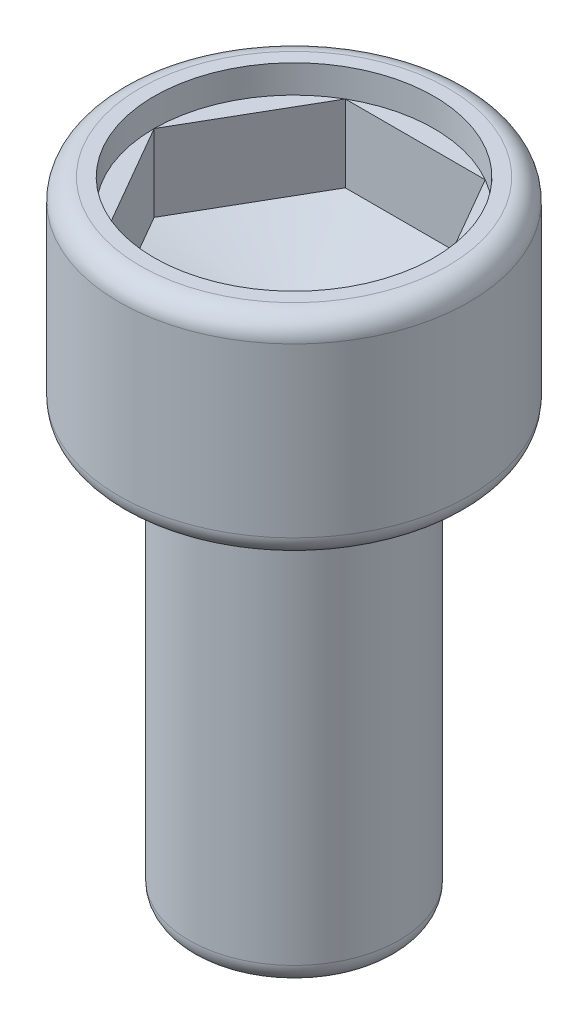
ISO-10303-21;
HEADER;
FILE_DESCRIPTION(('STEP AP214'),'2;1');
FILE_NAME('part.step','',(''),(''),'','','');
FILE_SCHEMA(('AUTOMOTIVE_DESIGN { 1 0 10303 214 1 1 1 1 }'));
ENDSEC;
DATA;
#1=APPLICATION_CONTEXT('core data for automotive mechanical design processes');
#2=APPLICATION_PROTOCOL_DEFINITION('international standard','automotive_design',2000,#1);
#3=PRODUCT_CONTEXT('',#1,'mechanical');
#4=PRODUCT('Part','Part','',(#3));
#5=PRODUCT_RELATED_PRODUCT_CATEGORY('part','',(#4));
#6=PRODUCT_DEFINITION_FORMATION('','',#4);
#7=PRODUCT_DEFINITION_CONTEXT('part definition',#1,'design');
#8=PRODUCT_DEFINITION('design','',#6,#7);
#9=PRODUCT_DEFINITION_SHAPE('','',#8);
#10=(LENGTH_UNIT() NAMED_UNIT(*) SI_UNIT(.MILLI.,.METRE.));
#11=(NAMED_UNIT(*) PLANE_ANGLE_UNIT() SI_UNIT($,.RADIAN.));
#12=(NAMED_UNIT(*) SI_UNIT($,.STERADIAN.) SOLID_ANGLE_UNIT());
#13=UNCERTAINTY_MEASURE_WITH_UNIT(LENGTH_MEASURE(1.E-05),#10,'distance_accuracy_value','');
#14=(GEOMETRIC_REPRESENTATION_CONTEXT(3) GLOBAL_UNCERTAINTY_ASSIGNED_CONTEXT((#13)) GLOBAL_UNIT_ASSIGNED_CONTEXT((#10,
#11,#12)) REPRESENTATION_CONTEXT('',''));
#15=CARTESIAN_POINT('',(0.,0.,0.));
#16=DIRECTION('',(0.,0.,1.));
#17=DIRECTION('',(1.,0.,0.));
#18=AXIS2_PLACEMENT_3D('',#15,#16,#17);
#19=CARTESIAN_POINT('',(0.,3.,0.));
#20=DIRECTION('',(0.,-1.,0.));
#21=DIRECTION('',(0.,0.,-1.));
#22=AXIS2_PLACEMENT_3D('',#19,#20,#21);
#23=CYLINDRICAL_SURFACE('',#22,2.5);
#24=CARTESIAN_POINT('',(0.,0.3,0.));
#25=DIRECTION('',(0.,1.,0.));
#26=DIRECTION('',(0.,0.,1.));
#27=AXIS2_PLACEMENT_3D('',#24,#25,#26);
#28=CIRCLE('',#27,2.5);
#29=CARTESIAN_POINT('',(0.,0.3,2.5));
#30=VERTEX_POINT('',#29);
#31=EDGE_CURVE('E188',#30,#30,#28,.T.);
#32=ORIENTED_EDGE('',*,*,#31,.T.);
#33=EDGE_LOOP('',(#32));
#34=FACE_BOUND('',#33,.T.);
#35=CARTESIAN_POINT('',(0.,2.7,0.));
#36=DIRECTION('',(0.,1.,0.));
#37=DIRECTION('',(0.,0.,1.));
#38=AXIS2_PLACEMENT_3D('',#35,#36,#37);
#39=CIRCLE('',#38,2.5);
#40=CARTESIAN_POINT('',(0.,2.7,2.5));
#41=VERTEX_POINT('',#40);
#42=EDGE_CURVE('E184',#41,#41,#39,.F.);
#43=ORIENTED_EDGE('',*,*,#42,.T.);
#44=EDGE_LOOP('',(#43));
#45=FACE_BOUND('',#44,.T.);
#46=ADVANCED_FACE('F50',(#34,#45),#23,.T.);
#47=CARTESIAN_POINT('',(0.,3.,0.));
#48=DIRECTION('',(0.,1.,0.));
#49=DIRECTION('',(0.,0.,1.));
#50=AXIS2_PLACEMENT_3D('',#47,#48,#49);
#51=PLANE('',#50);
#52=CARTESIAN_POINT('',(0.,3.,0.));
#53=DIRECTION('',(0.,1.,0.));
#54=DIRECTION('',(0.,0.,1.));
#55=AXIS2_PLACEMENT_3D('',#52,#53,#54);
#56=CIRCLE('',#55,2.2);
#57=CARTESIAN_POINT('',(0.,3.,2.2));
#58=VERTEX_POINT('',#57);
#59=EDGE_CURVE('E196',#58,#58,#56,.T.);
#60=ORIENTED_EDGE('',*,*,#59,.T.);
#61=EDGE_LOOP('',(#60));
#62=FACE_BOUND('',#61,.T.);
#63=CARTESIAN_POINT('',(0.,3.,0.));
#64=DIRECTION('',(0.,1.,0.));
#65=DIRECTION('',(0.,0.,1.));
#66=AXIS2_PLACEMENT_3D('',#63,#64,#65);
#67=CIRCLE('',#66,2.);
#68=CARTESIAN_POINT('',(0.,3.,2.));
#69=VERTEX_POINT('',#68);
#70=EDGE_CURVE('E122',#69,#69,#67,.T.);
#71=ORIENTED_EDGE('',*,*,#70,.F.);
#72=EDGE_LOOP('',(#71));
#73=FACE_BOUND('',#72,.T.);
#74=ADVANCED_FACE('F215',(#62,#73),#51,.T.);
#75=CARTESIAN_POINT('',(0.,0.,0.));
#76=DIRECTION('',(0.,1.,0.));
#77=DIRECTION('',(0.,0.,1.));
#78=AXIS2_PLACEMENT_3D('',#75,#76,#77);
#79=PLANE('',#78);
#80=CARTESIAN_POINT('',(0.,0.,0.));
#81=DIRECTION('',(0.,1.,0.));
#82=DIRECTION('',(0.,0.,1.));
#83=AXIS2_PLACEMENT_3D('',#80,#81,#82);
#84=CIRCLE('',#83,2.2);
#85=CARTESIAN_POINT('',(0.,0.,2.2));
#86=VERTEX_POINT('',#85);
#87=EDGE_CURVE('E192',#86,#86,#84,.F.);
#88=ORIENTED_EDGE('',*,*,#87,.T.);
#89=EDGE_LOOP('',(#88));
#90=FACE_BOUND('',#89,.T.);
#91=CARTESIAN_POINT('',(0.,0.,0.));
#92=DIRECTION('',(0.,-1.,0.));
#93=DIRECTION('',(0.,0.,-1.));
#94=AXIS2_PLACEMENT_3D('',#91,#92,#93);
#95=CIRCLE('',#94,1.5);
#96=CARTESIAN_POINT('',(0.,0.,-1.5));
#97=VERTEX_POINT('',#96);
#98=EDGE_CURVE('E183',#97,#97,#95,.T.);
#99=ORIENTED_EDGE('',*,*,#98,.F.);
#100=EDGE_LOOP('',(#99));
#101=FACE_BOUND('',#100,.T.);
#102=ADVANCED_FACE('F221',(#90,#101),#79,.F.);
#103=CARTESIAN_POINT('',(0.,2.6,0.));
#104=DIRECTION('',(0.,1.,0.));
#105=DIRECTION('',(0.,0.,1.));
#106=AXIS2_PLACEMENT_3D('',#103,#104,#105);
#107=CYLINDRICAL_SURFACE('',#106,2.);
#108=ORIENTED_EDGE('',*,*,#70,.T.);
#109=EDGE_LOOP('',(#108));
#110=FACE_BOUND('',#109,.T.);
#111=CARTESIAN_POINT('',(0.,2.6,0.));
#112=DIRECTION('',(0.,1.,0.));
#113=DIRECTION('',(0.,0.,1.));
#114=AXIS2_PLACEMENT_3D('',#111,#112,#113);
#115=CIRCLE('',#114,2.);
#116=CARTESIAN_POINT('',(-1.,2.6,1.73205080756888));
#117=VERTEX_POINT('',#116);
#118=CARTESIAN_POINT('',(0.999999999999999,2.6,1.73205080756888));
#119=VERTEX_POINT('',#118);
#120=EDGE_CURVE('E251',#117,#119,#115,.T.);
#121=ORIENTED_EDGE('',*,*,#120,.F.);
#122=CARTESIAN_POINT('',(-2.,2.6,0.));
#123=VERTEX_POINT('',#122);
#124=EDGE_CURVE('E279',#123,#117,#115,.T.);
#125=ORIENTED_EDGE('',*,*,#124,.F.);
#126=CARTESIAN_POINT('',(-0.999999999999998,2.6,-1.73205080756888));
#127=VERTEX_POINT('',#126);
#128=EDGE_CURVE('E294',#127,#123,#115,.T.);
#129=ORIENTED_EDGE('',*,*,#128,.F.);
#130=CARTESIAN_POINT('',(1.,2.6,-1.73205080756888));
#131=VERTEX_POINT('',#130);
#132=EDGE_CURVE('E301',#131,#127,#115,.T.);
#133=ORIENTED_EDGE('',*,*,#132,.F.);
#134=CARTESIAN_POINT('',(2.,2.6,0.));
#135=VERTEX_POINT('',#134);
#136=EDGE_CURVE('E65',#135,#131,#115,.T.);
#137=ORIENTED_EDGE('',*,*,#136,.F.);
#138=EDGE_CURVE('E246',#119,#135,#115,.T.);
#139=ORIENTED_EDGE('',*,*,#138,.F.);
#140=EDGE_LOOP('',(#121,#125,#129,#133,#137,#139));
#141=FACE_BOUND('',#140,.T.);
#142=ADVANCED_FACE('F239',(#110,#141),#107,.F.);
#143=CARTESIAN_POINT('',(0.,2.6,0.));
#144=DIRECTION('',(0.,1.,0.));
#145=DIRECTION('',(0.,0.,1.));
#146=AXIS2_PLACEMENT_3D('',#143,#144,#145);
#147=PLANE('',#146);
#148=DIRECTION('',(-0.5,0.,0.866025403784439));
#149=VECTOR('',#148,1.);
#150=CARTESIAN_POINT('',(1.,2.6,1.73205080756888));
#151=LINE('',#150,#149);
#152=EDGE_CURVE('E133',#135,#119,#151,.T.);
#153=ORIENTED_EDGE('',*,*,#152,.T.);
#154=ORIENTED_EDGE('',*,*,#138,.T.);
#155=EDGE_LOOP('',(#153,#154));
#156=FACE_BOUND('',#155,.T.);
#157=ADVANCED_FACE('F269',(#156),#147,.T.);
#158=DIRECTION('',(-1.,0.,0.));
#159=VECTOR('',#158,1.);
#160=CARTESIAN_POINT('',(-1.,2.6,1.73205080756888));
#161=LINE('',#160,#159);
#162=EDGE_CURVE('E264',#119,#117,#161,.T.);
#163=ORIENTED_EDGE('',*,*,#162,.T.);
#164=ORIENTED_EDGE('',*,*,#120,.T.);
#165=EDGE_LOOP('',(#163,#164));
#166=FACE_BOUND('',#165,.T.);
#167=ADVANCED_FACE('F273',(#166),#147,.T.);
#168=DIRECTION('',(-0.5,0.,-0.866025403784439));
#169=VECTOR('',#168,1.);
#170=CARTESIAN_POINT('',(-2.,2.6,0.));
#171=LINE('',#170,#169);
#172=EDGE_CURVE('E261',#117,#123,#171,.T.);
#173=ORIENTED_EDGE('',*,*,#172,.T.);
#174=ORIENTED_EDGE('',*,*,#124,.T.);
#175=EDGE_LOOP('',(#173,#174));
#176=FACE_BOUND('',#175,.T.);
#177=ADVANCED_FACE('F291',(#176),#147,.T.);
#178=DIRECTION('',(0.5,0.,-0.866025403784439));
#179=VECTOR('',#178,1.);
#180=CARTESIAN_POINT('',(-1.,2.6,-1.73205080756888));
#181=LINE('',#180,#179);
#182=EDGE_CURVE('E258',#123,#127,#181,.T.);
#183=ORIENTED_EDGE('',*,*,#182,.T.);
#184=ORIENTED_EDGE('',*,*,#128,.T.);
#185=EDGE_LOOP('',(#183,#184));
#186=FACE_BOUND('',#185,.T.);
#187=ADVANCED_FACE('F299',(#186),#147,.T.);
#188=DIRECTION('',(1.,0.,0.));
#189=VECTOR('',#188,1.);
#190=CARTESIAN_POINT('',(1.,2.6,-1.73205080756888));
#191=LINE('',#190,#189);
#192=EDGE_CURVE('E250',#127,#131,#191,.T.);
#193=ORIENTED_EDGE('',*,*,#192,.T.);
#194=ORIENTED_EDGE('',*,*,#132,.T.);
#195=EDGE_LOOP('',(#193,#194));
#196=FACE_BOUND('',#195,.T.);
#197=ADVANCED_FACE('F310',(#196),#147,.T.);
#198=DIRECTION('',(0.5,0.,0.866025403784439));
#199=VECTOR('',#198,1.);
#200=CARTESIAN_POINT('',(2.,2.6,0.));
#201=LINE('',#200,#199);
#202=EDGE_CURVE('E166',#131,#135,#201,.T.);
#203=ORIENTED_EDGE('',*,*,#202,.T.);
#204=ORIENTED_EDGE('',*,*,#136,.T.);
#205=EDGE_LOOP('',(#203,#204));
#206=FACE_BOUND('',#205,.T.);
#207=ADVANCED_FACE('F311',(#206),#147,.T.);
#208=CARTESIAN_POINT('',(2.,1.5,0.));
#209=DIRECTION('',(0.866025403784439,0.,-0.5));
#210=DIRECTION('',(-0.5,0.,-0.866025403784439));
#211=AXIS2_PLACEMENT_3D('',#208,#209,#210);
#212=PLANE('',#211);
#213=ORIENTED_EDGE('',*,*,#202,.F.);
#214=DIRECTION('',(0.,1.,0.));
#215=VECTOR('',#214,1.);
#216=CARTESIAN_POINT('',(1.,1.5,-1.73205080756888));
#217=LINE('',#216,#215);
#218=CARTESIAN_POINT('',(0.999999999999999,1.5,-1.73205080756888));
#219=VERTEX_POINT('',#218);
#220=EDGE_CURVE('E137',#219,#131,#217,.T.);
#221=ORIENTED_EDGE('',*,*,#220,.F.);
#222=DIRECTION('',(-0.5,0.,-0.866025403784439));
#223=VECTOR('',#222,1.);
#224=CARTESIAN_POINT('',(2.,1.5,0.));
#225=LINE('',#224,#223);
#226=CARTESIAN_POINT('',(2.,1.5,0.));
#227=VERTEX_POINT('',#226);
#228=EDGE_CURVE('E140',#227,#219,#225,.T.);
#229=ORIENTED_EDGE('',*,*,#228,.F.);
#230=DIRECTION('',(0.,1.,0.));
#231=VECTOR('',#230,1.);
#232=CARTESIAN_POINT('',(2.,1.5,0.));
#233=LINE('',#232,#231);
#234=EDGE_CURVE('E128',#227,#135,#233,.T.);
#235=ORIENTED_EDGE('',*,*,#234,.T.);
#236=EDGE_LOOP('',(#213,#221,#229,#235));
#237=FACE_BOUND('',#236,.T.);
#238=ADVANCED_FACE('F141',(#237),#212,.F.);
#239=CARTESIAN_POINT('',(1.,1.5,-1.73205080756888));
#240=DIRECTION('',(0.,0.,-1.));
#241=DIRECTION('',(-1.,0.,0.));
#242=AXIS2_PLACEMENT_3D('',#239,#240,#241);
#243=PLANE('',#242);
#244=ORIENTED_EDGE('',*,*,#192,.F.);
#245=DIRECTION('',(0.,1.,0.));
#246=VECTOR('',#245,1.);
#247=CARTESIAN_POINT('',(-1.,1.5,-1.73205080756888));
#248=LINE('',#247,#246);
#249=CARTESIAN_POINT('',(-1.,1.5,-1.73205080756888));
#250=VERTEX_POINT('',#249);
#251=EDGE_CURVE('E175',#250,#127,#248,.T.);
#252=ORIENTED_EDGE('',*,*,#251,.F.);
#253=DIRECTION('',(-1.,0.,0.));
#254=VECTOR('',#253,1.);
#255=CARTESIAN_POINT('',(1.,1.5,-1.73205080756888));
#256=LINE('',#255,#254);
#257=EDGE_CURVE('E147',#219,#250,#256,.T.);
#258=ORIENTED_EDGE('',*,*,#257,.F.);
#259=ORIENTED_EDGE('',*,*,#220,.T.);
#260=EDGE_LOOP('',(#244,#252,#258,#259));
#261=FACE_BOUND('',#260,.T.);
#262=ADVANCED_FACE('F308',(#261),#243,.F.);
#263=CARTESIAN_POINT('',(-1.,1.5,-1.73205080756888));
#264=DIRECTION('',(-0.866025403784439,0.,-0.5));
#265=DIRECTION('',(-0.5,0.,0.866025403784439));
#266=AXIS2_PLACEMENT_3D('',#263,#264,#265);
#267=PLANE('',#266);
#268=ORIENTED_EDGE('',*,*,#182,.F.);
#269=DIRECTION('',(0.,1.,0.));
#270=VECTOR('',#269,1.);
#271=CARTESIAN_POINT('',(-2.,1.5,0.));
#272=LINE('',#271,#270);
#273=CARTESIAN_POINT('',(-2.,1.5,0.));
#274=VERTEX_POINT('',#273);
#275=EDGE_CURVE('E171',#274,#123,#272,.T.);
#276=ORIENTED_EDGE('',*,*,#275,.F.);
#277=DIRECTION('',(-0.5,0.,0.866025403784439));
#278=VECTOR('',#277,1.);
#279=CARTESIAN_POINT('',(-1.,1.5,-1.73205080756888));
#280=LINE('',#279,#278);
#281=EDGE_CURVE('E151',#250,#274,#280,.T.);
#282=ORIENTED_EDGE('',*,*,#281,.F.);
#283=ORIENTED_EDGE('',*,*,#251,.T.);
#284=EDGE_LOOP('',(#268,#276,#282,#283));
#285=FACE_BOUND('',#284,.T.);
#286=ADVANCED_FACE('F303',(#285),#267,.F.);
#287=CARTESIAN_POINT('',(-2.,1.5,0.));
#288=DIRECTION('',(-0.866025403784439,0.,0.5));
#289=DIRECTION('',(0.5,0.,0.866025403784439));
#290=AXIS2_PLACEMENT_3D('',#287,#288,#289);
#291=PLANE('',#290);
#292=ORIENTED_EDGE('',*,*,#172,.F.);
#293=DIRECTION('',(0.,1.,0.));
#294=VECTOR('',#293,1.);
#295=CARTESIAN_POINT('',(-1.,1.5,1.73205080756888));
#296=LINE('',#295,#294);
#297=CARTESIAN_POINT('',(-1.,1.5,1.73205080756888));
#298=VERTEX_POINT('',#297);
#299=EDGE_CURVE('E167',#298,#117,#296,.T.);
#300=ORIENTED_EDGE('',*,*,#299,.F.);
#301=DIRECTION('',(0.5,0.,0.866025403784439));
#302=VECTOR('',#301,1.);
#303=CARTESIAN_POINT('',(-2.,1.5,0.));
#304=LINE('',#303,#302);
#305=EDGE_CURVE('E158',#274,#298,#304,.T.);
#306=ORIENTED_EDGE('',*,*,#305,.F.);
#307=ORIENTED_EDGE('',*,*,#275,.T.);
#308=EDGE_LOOP('',(#292,#300,#306,#307));
#309=FACE_BOUND('',#308,.T.);
#310=ADVANCED_FACE('F288',(#309),#291,.F.);
#311=CARTESIAN_POINT('',(-1.,1.5,1.73205080756888));
#312=DIRECTION('',(0.,0.,1.));
#313=DIRECTION('',(1.,0.,0.));
#314=AXIS2_PLACEMENT_3D('',#311,#312,#313);
#315=PLANE('',#314);
#316=ORIENTED_EDGE('',*,*,#162,.F.);
#317=DIRECTION('',(0.,1.,0.));
#318=VECTOR('',#317,1.);
#319=CARTESIAN_POINT('',(1.,1.5,1.73205080756888));
#320=LINE('',#319,#318);
#321=CARTESIAN_POINT('',(1.,1.5,1.73205080756888));
#322=VERTEX_POINT('',#321);
#323=EDGE_CURVE('E163',#322,#119,#320,.T.);
#324=ORIENTED_EDGE('',*,*,#323,.F.);
#325=DIRECTION('',(1.,0.,0.));
#326=VECTOR('',#325,1.);
#327=CARTESIAN_POINT('',(-1.,1.5,1.73205080756888));
#328=LINE('',#327,#326);
#329=EDGE_CURVE('E138',#298,#322,#328,.T.);
#330=ORIENTED_EDGE('',*,*,#329,.F.);
#331=ORIENTED_EDGE('',*,*,#299,.T.);
#332=EDGE_LOOP('',(#316,#324,#330,#331));
#333=FACE_BOUND('',#332,.T.);
#334=ADVANCED_FACE('F282',(#333),#315,.F.);
#335=CARTESIAN_POINT('',(1.,1.5,1.73205080756888));
#336=DIRECTION('',(0.866025403784439,0.,0.5));
#337=DIRECTION('',(0.5,0.,-0.866025403784439));
#338=AXIS2_PLACEMENT_3D('',#335,#336,#337);
#339=PLANE('',#338);
#340=ORIENTED_EDGE('',*,*,#152,.F.);
#341=ORIENTED_EDGE('',*,*,#234,.F.);
#342=DIRECTION('',(0.5,0.,-0.866025403784439));
#343=VECTOR('',#342,1.);
#344=CARTESIAN_POINT('',(1.,1.5,1.73205080756888));
#345=LINE('',#344,#343);
#346=EDGE_CURVE('E132',#322,#227,#345,.T.);
#347=ORIENTED_EDGE('',*,*,#346,.F.);
#348=ORIENTED_EDGE('',*,*,#323,.T.);
#349=EDGE_LOOP('',(#340,#341,#347,#348));
#350=FACE_BOUND('',#349,.T.);
#351=ADVANCED_FACE('F130',(#350),#339,.F.);
#352=CARTESIAN_POINT('',(0.,1.5,0.));
#353=DIRECTION('',(0.,1.,0.));
#354=DIRECTION('',(0.,0.,1.));
#355=AXIS2_PLACEMENT_3D('',#352,#353,#354);
#356=PLANE('',#355);
#357=CARTESIAN_POINT('',(0.,1.5,0.));
#358=DIRECTION('',(0.,1.,0.));
#359=DIRECTION('',(0.,0.,1.));
#360=AXIS2_PLACEMENT_3D('',#357,#358,#359);
#361=CIRCLE('',#360,2.);
#362=EDGE_CURVE('E115',#227,#219,#361,.T.);
#363=ORIENTED_EDGE('',*,*,#362,.F.);
#364=ORIENTED_EDGE('',*,*,#228,.T.);
#365=EDGE_LOOP('',(#363,#364));
#366=FACE_BOUND('',#365,.T.);
#367=ADVANCED_FACE('F338',(#366),#356,.F.);
#368=EDGE_CURVE('E369',#219,#250,#361,.T.);
#369=ORIENTED_EDGE('',*,*,#368,.F.);
#370=ORIENTED_EDGE('',*,*,#257,.T.);
#371=EDGE_LOOP('',(#369,#370));
#372=FACE_BOUND('',#371,.T.);
#373=ADVANCED_FACE('F342',(#372),#356,.F.);
#374=EDGE_CURVE('E366',#250,#274,#361,.T.);
#375=ORIENTED_EDGE('',*,*,#374,.F.);
#376=ORIENTED_EDGE('',*,*,#281,.T.);
#377=EDGE_LOOP('',(#375,#376));
#378=FACE_BOUND('',#377,.T.);
#379=ADVANCED_FACE('F347',(#378),#356,.F.);
#380=EDGE_CURVE('E362',#274,#298,#361,.T.);
#381=ORIENTED_EDGE('',*,*,#380,.F.);
#382=ORIENTED_EDGE('',*,*,#305,.T.);
#383=EDGE_LOOP('',(#381,#382));
#384=FACE_BOUND('',#383,.T.);
#385=ADVANCED_FACE('F355',(#384),#356,.F.);
#386=EDGE_CURVE('E119',#298,#322,#361,.T.);
#387=ORIENTED_EDGE('',*,*,#386,.F.);
#388=ORIENTED_EDGE('',*,*,#329,.T.);
#389=EDGE_LOOP('',(#387,#388));
#390=FACE_BOUND('',#389,.T.);
#391=ADVANCED_FACE('F351',(#390),#356,.F.);
#392=EDGE_CURVE('E72',#322,#227,#361,.T.);
#393=ORIENTED_EDGE('',*,*,#392,.F.);
#394=ORIENTED_EDGE('',*,*,#346,.T.);
#395=EDGE_LOOP('',(#393,#394));
#396=FACE_BOUND('',#395,.T.);
#397=ADVANCED_FACE('F109',(#396),#356,.F.);
#398=CARTESIAN_POINT('',(0.,1.5,0.));
#399=DIRECTION('',(0.,1.,0.));
#400=DIRECTION('',(0.,0.,1.));
#401=AXIS2_PLACEMENT_3D('',#398,#399,#400);
#402=CONICAL_SURFACE('',#401,2.,1.32645023151569);
#403=CARTESIAN_POINT('',(0.,1.00134399431364,0.));
#404=VERTEX_POINT('',#403);
#405=VERTEX_LOOP('',#404);
#406=FACE_BOUND('',#405,.T.);
#407=ORIENTED_EDGE('',*,*,#392,.T.);
#408=ORIENTED_EDGE('',*,*,#362,.T.);
#409=ORIENTED_EDGE('',*,*,#368,.T.);
#410=ORIENTED_EDGE('',*,*,#374,.T.);
#411=ORIENTED_EDGE('',*,*,#380,.T.);
#412=ORIENTED_EDGE('',*,*,#386,.T.);
#413=EDGE_LOOP('',(#407,#408,#409,#410,#411,#412));
#414=FACE_BOUND('',#413,.T.);
#415=ADVANCED_FACE('F105',(#406,#414),#402,.F.);
#416=CARTESIAN_POINT('',(0.,-6.,0.));
#417=DIRECTION('',(0.,1.,0.));
#418=DIRECTION('',(0.,0.,1.));
#419=AXIS2_PLACEMENT_3D('',#416,#417,#418);
#420=CYLINDRICAL_SURFACE('',#419,1.5);
#421=CARTESIAN_POINT('',(0.,-5.7,0.));
#422=DIRECTION('',(0.,-1.,0.));
#423=DIRECTION('',(0.,0.,-1.));
#424=AXIS2_PLACEMENT_3D('',#421,#422,#423);
#425=CIRCLE('',#424,1.5);
#426=CARTESIAN_POINT('',(0.,-5.7,-1.5));
#427=VERTEX_POINT('',#426);
#428=EDGE_CURVE('E11',#427,#427,#425,.F.);
#429=ORIENTED_EDGE('',*,*,#428,.T.);
#430=EDGE_LOOP('',(#429));
#431=FACE_BOUND('',#430,.T.);
#432=ORIENTED_EDGE('',*,*,#98,.T.);
#433=EDGE_LOOP('',(#432));
#434=FACE_BOUND('',#433,.T.);
#435=ADVANCED_FACE('F108',(#431,#434),#420,.T.);
#436=CARTESIAN_POINT('',(0.,-6.,0.));
#437=DIRECTION('',(0.,-1.,0.));
#438=DIRECTION('',(0.,0.,-1.));
#439=AXIS2_PLACEMENT_3D('',#436,#437,#438);
#440=PLANE('',#439);
#441=CARTESIAN_POINT('',(0.,-6.,0.));
#442=DIRECTION('',(0.,-1.,0.));
#443=DIRECTION('',(0.,0.,-1.));
#444=AXIS2_PLACEMENT_3D('',#441,#442,#443);
#445=CIRCLE('',#444,1.2);
#446=CARTESIAN_POINT('',(0.,-6.,-1.2));
#447=VERTEX_POINT('',#446);
#448=EDGE_CURVE('E59',#447,#447,#445,.T.);
#449=ORIENTED_EDGE('',*,*,#448,.T.);
#450=EDGE_LOOP('',(#449));
#451=FACE_BOUND('',#450,.T.);
#452=ADVANCED_FACE('F203',(#451),#440,.T.);
#453=CARTESIAN_POINT('',(0.,0.3,0.));
#454=DIRECTION('',(0.,1.,0.));
#455=DIRECTION('',(0.,0.,1.));
#456=AXIS2_PLACEMENT_3D('',#453,#454,#455);
#457=TOROIDAL_SURFACE('',#456,2.2,0.3);
#458=ORIENTED_EDGE('',*,*,#87,.F.);
#459=EDGE_LOOP('',(#458));
#460=FACE_BOUND('',#459,.T.);
#461=ORIENTED_EDGE('',*,*,#31,.F.);
#462=EDGE_LOOP('',(#461));
#463=FACE_BOUND('',#462,.T.);
#464=ADVANCED_FACE('F211',(#460,#463),#457,.T.);
#465=CARTESIAN_POINT('',(0.,2.7,0.));
#466=DIRECTION('',(0.,1.,0.));
#467=DIRECTION('',(0.,0.,1.));
#468=AXIS2_PLACEMENT_3D('',#465,#466,#467);
#469=TOROIDAL_SURFACE('',#468,2.2,0.3);
#470=ORIENTED_EDGE('',*,*,#42,.F.);
#471=EDGE_LOOP('',(#470));
#472=FACE_BOUND('',#471,.T.);
#473=ORIENTED_EDGE('',*,*,#59,.F.);
#474=EDGE_LOOP('',(#473));
#475=FACE_BOUND('',#474,.T.);
#476=ADVANCED_FACE('F206',(#472,#475),#469,.T.);
#477=CARTESIAN_POINT('',(0.,-5.7,0.));
#478=DIRECTION('',(0.,-1.,0.));
#479=DIRECTION('',(0.,0.,-1.));
#480=AXIS2_PLACEMENT_3D('',#477,#478,#479);
#481=TOROIDAL_SURFACE('',#480,1.2,0.3);
#482=ORIENTED_EDGE('',*,*,#428,.F.);
#483=EDGE_LOOP('',(#482));
#484=FACE_BOUND('',#483,.T.);
#485=ORIENTED_EDGE('',*,*,#448,.F.);
#486=EDGE_LOOP('',(#485));
#487=FACE_BOUND('',#486,.T.);
#488=ADVANCED_FACE('F52',(#484,#487),#481,.T.);
#489=CLOSED_SHELL('',(#46,#74,#102,#142,#157,#167,#177,#187,#197,#207,#238,#262,#286,#310,#334,
#351,#367,#373,#379,#385,#391,#397,#415,#435,#452,#464,#476,#488));
#490=MANIFOLD_SOLID_BREP('B2',#489);
#491=ADVANCED_BREP_SHAPE_REPRESENTATION('',(#18,#490),#14);
#492=SHAPE_DEFINITION_REPRESENTATION(#9,#491);
ENDSEC;
END-ISO-10303-21;
